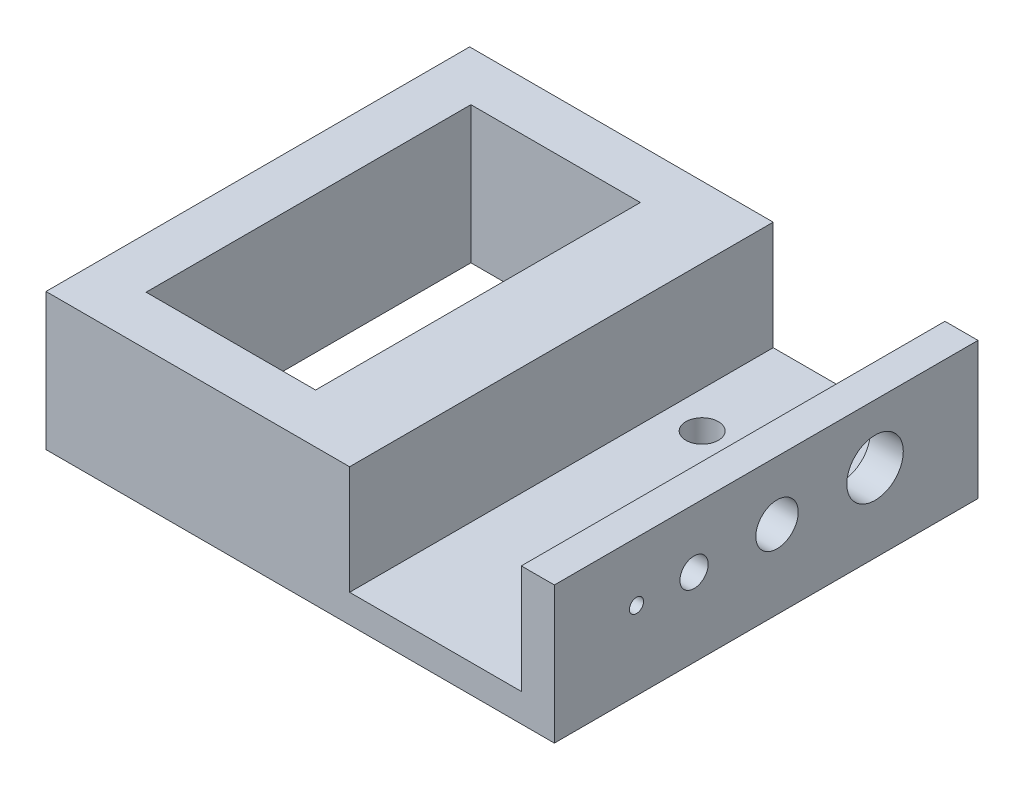
ISO-10303-21;
HEADER;
FILE_DESCRIPTION(('STEP AP214'),'2;1');
FILE_NAME('part.step','',(''),(''),'','','');
FILE_SCHEMA(('AUTOMOTIVE_DESIGN { 1 0 10303 214 1 1 1 1 }'));
ENDSEC;
DATA;
#1=APPLICATION_CONTEXT('core data for automotive mechanical design processes');
#2=APPLICATION_PROTOCOL_DEFINITION('international standard','automotive_design',2000,#1);
#3=PRODUCT_CONTEXT('',#1,'mechanical');
#4=PRODUCT('Part','Part','',(#3));
#5=PRODUCT_RELATED_PRODUCT_CATEGORY('part','',(#4));
#6=PRODUCT_DEFINITION_FORMATION('','',#4);
#7=PRODUCT_DEFINITION_CONTEXT('part definition',#1,'design');
#8=PRODUCT_DEFINITION('design','',#6,#7);
#9=PRODUCT_DEFINITION_SHAPE('','',#8);
#10=(LENGTH_UNIT() NAMED_UNIT(*) SI_UNIT(.MILLI.,.METRE.));
#11=(NAMED_UNIT(*) PLANE_ANGLE_UNIT() SI_UNIT($,.RADIAN.));
#12=(NAMED_UNIT(*) SI_UNIT($,.STERADIAN.) SOLID_ANGLE_UNIT());
#13=UNCERTAINTY_MEASURE_WITH_UNIT(LENGTH_MEASURE(1.E-05),#10,'distance_accuracy_value','');
#14=(GEOMETRIC_REPRESENTATION_CONTEXT(3) GLOBAL_UNCERTAINTY_ASSIGNED_CONTEXT((#13)) GLOBAL_UNIT_ASSIGNED_CONTEXT((#10,
#11,#12)) REPRESENTATION_CONTEXT('',''));
#15=CARTESIAN_POINT('',(0.,0.,0.));
#16=DIRECTION('',(0.,0.,1.));
#17=DIRECTION('',(1.,0.,0.));
#18=AXIS2_PLACEMENT_3D('',#15,#16,#17);
#19=CARTESIAN_POINT('',(18.,10.,0.));
#20=DIRECTION('',(1.,0.,0.));
#21=DIRECTION('',(0.,0.,-1.));
#22=AXIS2_PLACEMENT_3D('',#19,#20,#21);
#23=PLANE('',#22);
#24=CARTESIAN_POINT('',(18.,5.53489453808616,9.18421985815603));
#25=DIRECTION('',(1.,0.,0.));
#26=DIRECTION('',(0.,0.,-1.));
#27=AXIS2_PLACEMENT_3D('',#24,#25,#26);
#28=CIRCLE('',#27,0.500000000000001);
#29=CARTESIAN_POINT('',(18.,5.53489453808616,8.68421985815603));
#30=VERTEX_POINT('',#29);
#31=EDGE_CURVE('E239',#30,#30,#28,.T.);
#32=ORIENTED_EDGE('',*,*,#31,.F.);
#33=EDGE_LOOP('',(#32));
#34=FACE_BOUND('',#33,.T.);
#35=CARTESIAN_POINT('',(18.,5.53489453808616,5.10716358109975));
#36=DIRECTION('',(1.,0.,0.));
#37=DIRECTION('',(0.,0.,-1.));
#38=AXIS2_PLACEMENT_3D('',#35,#36,#37);
#39=CIRCLE('',#38,1.);
#40=CARTESIAN_POINT('',(18.,5.53489453808616,4.10716358109975));
#41=VERTEX_POINT('',#40);
#42=EDGE_CURVE('E279',#41,#41,#39,.T.);
#43=ORIENTED_EDGE('',*,*,#42,.F.);
#44=EDGE_LOOP('',(#43));
#45=FACE_BOUND('',#44,.T.);
#46=CARTESIAN_POINT('',(18.,5.53489453808616,-0.769869669337758));
#47=DIRECTION('',(1.,0.,0.));
#48=DIRECTION('',(0.,0.,-1.));
#49=AXIS2_PLACEMENT_3D('',#46,#47,#48);
#50=CIRCLE('',#49,1.5);
#51=CARTESIAN_POINT('',(18.,5.53489453808616,-2.26986966933776));
#52=VERTEX_POINT('',#51);
#53=EDGE_CURVE('E283',#52,#52,#50,.T.);
#54=ORIENTED_EDGE('',*,*,#53,.F.);
#55=EDGE_LOOP('',(#54));
#56=FACE_BOUND('',#55,.T.);
#57=CARTESIAN_POINT('',(18.,5.53489453808616,-7.70953992815696));
#58=DIRECTION('',(1.,0.,0.));
#59=DIRECTION('',(0.,0.,-1.));
#60=AXIS2_PLACEMENT_3D('',#57,#58,#59);
#61=CIRCLE('',#60,2.);
#62=CARTESIAN_POINT('',(18.,5.53489453808616,-9.70953992815696));
#63=VERTEX_POINT('',#62);
#64=EDGE_CURVE('E274',#63,#63,#61,.T.);
#65=ORIENTED_EDGE('',*,*,#64,.F.);
#66=EDGE_LOOP('',(#65));
#67=FACE_BOUND('',#66,.T.);
#68=DIRECTION('',(0.,-1.,0.));
#69=VECTOR('',#68,1.);
#70=CARTESIAN_POINT('',(18.,10.,-15.));
#71=LINE('',#70,#69);
#72=CARTESIAN_POINT('',(18.,9.7,-15.));
#73=VERTEX_POINT('',#72);
#74=CARTESIAN_POINT('',(18.,0.,-15.));
#75=VERTEX_POINT('',#74);
#76=EDGE_CURVE('E219',#73,#75,#71,.T.);
#77=ORIENTED_EDGE('',*,*,#76,.F.);
#78=DIRECTION('',(0.,0.,1.));
#79=VECTOR('',#78,1.);
#80=CARTESIAN_POINT('',(18.,9.7,0.));
#81=LINE('',#80,#79);
#82=CARTESIAN_POINT('',(18.,9.7,15.));
#83=VERTEX_POINT('',#82);
#84=EDGE_CURVE('E301',#73,#83,#81,.T.);
#85=ORIENTED_EDGE('',*,*,#84,.T.);
#86=DIRECTION('',(0.,-1.,0.));
#87=VECTOR('',#86,1.);
#88=CARTESIAN_POINT('',(18.,10.,15.));
#89=LINE('',#88,#87);
#90=CARTESIAN_POINT('',(18.,0.,15.));
#91=VERTEX_POINT('',#90);
#92=EDGE_CURVE('E149',#83,#91,#89,.T.);
#93=ORIENTED_EDGE('',*,*,#92,.T.);
#94=DIRECTION('',(0.,0.,1.));
#95=VECTOR('',#94,1.);
#96=CARTESIAN_POINT('',(18.,0.,0.));
#97=LINE('',#96,#95);
#98=EDGE_CURVE('E194',#75,#91,#97,.T.);
#99=ORIENTED_EDGE('',*,*,#98,.F.);
#100=EDGE_LOOP('',(#77,#85,#93,#99));
#101=FACE_BOUND('',#100,.T.);
#102=ADVANCED_FACE('F45',(#34,#45,#56,#67,#101),#23,.T.);
#103=CARTESIAN_POINT('',(0.,10.,-15.));
#104=DIRECTION('',(0.,0.,-1.));
#105=DIRECTION('',(-1.,0.,0.));
#106=AXIS2_PLACEMENT_3D('',#103,#104,#105);
#107=PLANE('',#106);
#108=DIRECTION('',(0.,-1.,0.));
#109=VECTOR('',#108,1.);
#110=CARTESIAN_POINT('',(-18.,10.,-15.));
#111=LINE('',#110,#109);
#112=CARTESIAN_POINT('',(-18.,9.7,-15.));
#113=VERTEX_POINT('',#112);
#114=CARTESIAN_POINT('',(-18.,0.,-15.));
#115=VERTEX_POINT('',#114);
#116=EDGE_CURVE('E216',#113,#115,#111,.T.);
#117=ORIENTED_EDGE('',*,*,#116,.F.);
#118=DIRECTION('',(1.,0.,0.));
#119=VECTOR('',#118,1.);
#120=CARTESIAN_POINT('',(0.,9.7,-15.));
#121=LINE('',#120,#119);
#122=CARTESIAN_POINT('',(3.49898960918438,9.7,-15.));
#123=VERTEX_POINT('',#122);
#124=EDGE_CURVE('E311',#113,#123,#121,.T.);
#125=ORIENTED_EDGE('',*,*,#124,.T.);
#126=DIRECTION('',(0.,1.,0.));
#127=VECTOR('',#126,1.);
#128=CARTESIAN_POINT('',(3.49898960918438,10.,-15.));
#129=LINE('',#128,#127);
#130=CARTESIAN_POINT('',(3.49898960918438,2.,-15.));
#131=VERTEX_POINT('',#130);
#132=EDGE_CURVE('E170',#131,#123,#129,.T.);
#133=ORIENTED_EDGE('',*,*,#132,.F.);
#134=DIRECTION('',(1.,0.,0.));
#135=VECTOR('',#134,1.);
#136=CARTESIAN_POINT('',(0.,2.,-15.));
#137=LINE('',#136,#135);
#138=CARTESIAN_POINT('',(15.6598148259363,2.,-15.));
#139=VERTEX_POINT('',#138);
#140=EDGE_CURVE('E174',#131,#139,#137,.T.);
#141=ORIENTED_EDGE('',*,*,#140,.T.);
#142=DIRECTION('',(0.,-1.,0.));
#143=VECTOR('',#142,1.);
#144=CARTESIAN_POINT('',(15.6598148259363,10.,-15.));
#145=LINE('',#144,#143);
#146=CARTESIAN_POINT('',(15.6598148259363,9.7,-15.));
#147=VERTEX_POINT('',#146);
#148=EDGE_CURVE('E157',#147,#139,#145,.T.);
#149=ORIENTED_EDGE('',*,*,#148,.F.);
#150=EDGE_CURVE('E138',#147,#73,#121,.T.);
#151=ORIENTED_EDGE('',*,*,#150,.T.);
#152=ORIENTED_EDGE('',*,*,#76,.T.);
#153=DIRECTION('',(1.,0.,0.));
#154=VECTOR('',#153,1.);
#155=CARTESIAN_POINT('',(0.,0.,-15.));
#156=LINE('',#155,#154);
#157=EDGE_CURVE('E198',#115,#75,#156,.T.);
#158=ORIENTED_EDGE('',*,*,#157,.F.);
#159=EDGE_LOOP('',(#117,#125,#133,#141,#149,#151,#152,#158));
#160=FACE_BOUND('',#159,.T.);
#161=ADVANCED_FACE('F344',(#160),#107,.T.);
#162=CARTESIAN_POINT('',(-18.,10.,0.));
#163=DIRECTION('',(1.,0.,0.));
#164=DIRECTION('',(0.,0.,-1.));
#165=AXIS2_PLACEMENT_3D('',#162,#163,#164);
#166=PLANE('',#165);
#167=DIRECTION('',(0.,0.,1.));
#168=VECTOR('',#167,1.);
#169=CARTESIAN_POINT('',(-18.,9.7,0.));
#170=LINE('',#169,#168);
#171=CARTESIAN_POINT('',(-18.,9.7,15.));
#172=VERTEX_POINT('',#171);
#173=EDGE_CURVE('E305',#113,#172,#170,.T.);
#174=ORIENTED_EDGE('',*,*,#173,.F.);
#175=ORIENTED_EDGE('',*,*,#116,.T.);
#176=DIRECTION('',(0.,0.,1.));
#177=VECTOR('',#176,1.);
#178=CARTESIAN_POINT('',(-18.,0.,0.));
#179=LINE('',#178,#177);
#180=CARTESIAN_POINT('',(-18.,0.,15.));
#181=VERTEX_POINT('',#180);
#182=EDGE_CURVE('E202',#115,#181,#179,.T.);
#183=ORIENTED_EDGE('',*,*,#182,.T.);
#184=DIRECTION('',(0.,-1.,0.));
#185=VECTOR('',#184,1.);
#186=CARTESIAN_POINT('',(-18.,10.,15.));
#187=LINE('',#186,#185);
#188=EDGE_CURVE('E212',#172,#181,#187,.T.);
#189=ORIENTED_EDGE('',*,*,#188,.F.);
#190=EDGE_LOOP('',(#174,#175,#183,#189));
#191=FACE_BOUND('',#190,.T.);
#192=ADVANCED_FACE('F339',(#191),#166,.F.);
#193=CARTESIAN_POINT('',(0.,10.,-11.5));
#194=DIRECTION('',(0.,0.,-1.));
#195=DIRECTION('',(-1.,0.,0.));
#196=AXIS2_PLACEMENT_3D('',#193,#194,#195);
#197=PLANE('',#196);
#198=DIRECTION('',(1.,0.,0.));
#199=VECTOR('',#198,1.);
#200=CARTESIAN_POINT('',(0.,9.7,-11.5));
#201=LINE('',#200,#199);
#202=CARTESIAN_POINT('',(-14.4102564102564,9.7,-11.5));
#203=VERTEX_POINT('',#202);
#204=CARTESIAN_POINT('',(-2.41025641025642,9.7,-11.5));
#205=VERTEX_POINT('',#204);
#206=EDGE_CURVE('E263',#203,#205,#201,.T.);
#207=ORIENTED_EDGE('',*,*,#206,.F.);
#208=DIRECTION('',(0.,-1.,0.));
#209=VECTOR('',#208,1.);
#210=CARTESIAN_POINT('',(-14.4102564102564,10.,-11.5));
#211=LINE('',#210,#209);
#212=CARTESIAN_POINT('',(-14.4102564102564,0.,-11.5));
#213=VERTEX_POINT('',#212);
#214=EDGE_CURVE('E209',#203,#213,#211,.T.);
#215=ORIENTED_EDGE('',*,*,#214,.T.);
#216=DIRECTION('',(1.,0.,0.));
#217=VECTOR('',#216,1.);
#218=CARTESIAN_POINT('',(0.,0.,-11.5));
#219=LINE('',#218,#217);
#220=CARTESIAN_POINT('',(-2.41025641025642,0.,-11.5));
#221=VERTEX_POINT('',#220);
#222=EDGE_CURVE('E178',#213,#221,#219,.T.);
#223=ORIENTED_EDGE('',*,*,#222,.T.);
#224=DIRECTION('',(0.,-1.,0.));
#225=VECTOR('',#224,1.);
#226=CARTESIAN_POINT('',(-2.41025641025642,10.,-11.5));
#227=LINE('',#226,#225);
#228=EDGE_CURVE('E213',#205,#221,#227,.T.);
#229=ORIENTED_EDGE('',*,*,#228,.F.);
#230=EDGE_LOOP('',(#207,#215,#223,#229));
#231=FACE_BOUND('',#230,.T.);
#232=ADVANCED_FACE('F47',(#231),#197,.F.);
#233=CARTESIAN_POINT('',(-2.41025641025641,10.,0.));
#234=DIRECTION('',(1.,0.,0.));
#235=DIRECTION('',(0.,0.,-1.));
#236=AXIS2_PLACEMENT_3D('',#233,#234,#235);
#237=PLANE('',#236);
#238=DIRECTION('',(0.,0.,1.));
#239=VECTOR('',#238,1.);
#240=CARTESIAN_POINT('',(-2.41025641025641,9.7,0.));
#241=LINE('',#240,#239);
#242=CARTESIAN_POINT('',(-2.41025641025641,9.7,11.5));
#243=VERTEX_POINT('',#242);
#244=EDGE_CURVE('E268',#205,#243,#241,.T.);
#245=ORIENTED_EDGE('',*,*,#244,.F.);
#246=ORIENTED_EDGE('',*,*,#228,.T.);
#247=DIRECTION('',(0.,0.,1.));
#248=VECTOR('',#247,1.);
#249=CARTESIAN_POINT('',(-2.41025641025641,0.,0.));
#250=LINE('',#249,#248);
#251=CARTESIAN_POINT('',(-2.41025641025641,0.,11.5));
#252=VERTEX_POINT('',#251);
#253=EDGE_CURVE('E182',#221,#252,#250,.T.);
#254=ORIENTED_EDGE('',*,*,#253,.T.);
#255=DIRECTION('',(0.,-1.,0.));
#256=VECTOR('',#255,1.);
#257=CARTESIAN_POINT('',(-2.41025641025641,10.,11.5));
#258=LINE('',#257,#256);
#259=EDGE_CURVE('E227',#243,#252,#258,.T.);
#260=ORIENTED_EDGE('',*,*,#259,.F.);
#261=EDGE_LOOP('',(#245,#246,#254,#260));
#262=FACE_BOUND('',#261,.T.);
#263=ADVANCED_FACE('F327',(#262),#237,.F.);
#264=CARTESIAN_POINT('',(0.,10.,11.5));
#265=DIRECTION('',(0.,0.,-1.));
#266=DIRECTION('',(-1.,0.,0.));
#267=AXIS2_PLACEMENT_3D('',#264,#265,#266);
#268=PLANE('',#267);
#269=DIRECTION('',(0.,-1.,0.));
#270=VECTOR('',#269,1.);
#271=CARTESIAN_POINT('',(-14.4102564102564,10.,11.5));
#272=LINE('',#271,#270);
#273=CARTESIAN_POINT('',(-14.4102564102564,9.7,11.5));
#274=VERTEX_POINT('',#273);
#275=CARTESIAN_POINT('',(-14.4102564102564,0.,11.5));
#276=VERTEX_POINT('',#275);
#277=EDGE_CURVE('E224',#274,#276,#272,.T.);
#278=ORIENTED_EDGE('',*,*,#277,.F.);
#279=DIRECTION('',(1.,0.,0.));
#280=VECTOR('',#279,1.);
#281=CARTESIAN_POINT('',(0.,9.7,11.5));
#282=LINE('',#281,#280);
#283=EDGE_CURVE('E61',#274,#243,#282,.T.);
#284=ORIENTED_EDGE('',*,*,#283,.T.);
#285=ORIENTED_EDGE('',*,*,#259,.T.);
#286=DIRECTION('',(1.,0.,0.));
#287=VECTOR('',#286,1.);
#288=CARTESIAN_POINT('',(0.,0.,11.5));
#289=LINE('',#288,#287);
#290=EDGE_CURVE('E186',#276,#252,#289,.T.);
#291=ORIENTED_EDGE('',*,*,#290,.F.);
#292=EDGE_LOOP('',(#278,#284,#285,#291));
#293=FACE_BOUND('',#292,.T.);
#294=ADVANCED_FACE('F325',(#293),#268,.T.);
#295=CARTESIAN_POINT('',(-14.4102564102564,10.,0.));
#296=DIRECTION('',(1.,0.,0.));
#297=DIRECTION('',(0.,0.,-1.));
#298=AXIS2_PLACEMENT_3D('',#295,#296,#297);
#299=PLANE('',#298);
#300=ORIENTED_EDGE('',*,*,#214,.F.);
#301=DIRECTION('',(0.,0.,1.));
#302=VECTOR('',#301,1.);
#303=CARTESIAN_POINT('',(-14.4102564102564,9.7,0.));
#304=LINE('',#303,#302);
#305=EDGE_CURVE('E312',#203,#274,#304,.T.);
#306=ORIENTED_EDGE('',*,*,#305,.T.);
#307=ORIENTED_EDGE('',*,*,#277,.T.);
#308=DIRECTION('',(0.,0.,1.));
#309=VECTOR('',#308,1.);
#310=CARTESIAN_POINT('',(-14.4102564102564,0.,0.));
#311=LINE('',#310,#309);
#312=EDGE_CURVE('E190',#213,#276,#311,.T.);
#313=ORIENTED_EDGE('',*,*,#312,.F.);
#314=EDGE_LOOP('',(#300,#306,#307,#313));
#315=FACE_BOUND('',#314,.T.);
#316=ADVANCED_FACE('F336',(#315),#299,.T.);
#317=CARTESIAN_POINT('',(0.,10.,15.));
#318=DIRECTION('',(0.,0.,-1.));
#319=DIRECTION('',(-1.,0.,0.));
#320=AXIS2_PLACEMENT_3D('',#317,#318,#319);
#321=PLANE('',#320);
#322=DIRECTION('',(1.,0.,0.));
#323=VECTOR('',#322,1.);
#324=CARTESIAN_POINT('',(0.,9.7,15.));
#325=LINE('',#324,#323);
#326=CARTESIAN_POINT('',(3.49898960918438,9.7,15.));
#327=VERTEX_POINT('',#326);
#328=EDGE_CURVE('E69',#172,#327,#325,.T.);
#329=ORIENTED_EDGE('',*,*,#328,.F.);
#330=ORIENTED_EDGE('',*,*,#188,.T.);
#331=DIRECTION('',(1.,0.,0.));
#332=VECTOR('',#331,1.);
#333=CARTESIAN_POINT('',(0.,0.,15.));
#334=LINE('',#333,#332);
#335=EDGE_CURVE('E206',#181,#91,#334,.T.);
#336=ORIENTED_EDGE('',*,*,#335,.T.);
#337=ORIENTED_EDGE('',*,*,#92,.F.);
#338=CARTESIAN_POINT('',(15.6598148259363,9.7,15.));
#339=VERTEX_POINT('',#338);
#340=EDGE_CURVE('E135',#339,#83,#325,.T.);
#341=ORIENTED_EDGE('',*,*,#340,.F.);
#342=DIRECTION('',(0.,-1.,0.));
#343=VECTOR('',#342,1.);
#344=CARTESIAN_POINT('',(15.6598148259363,10.,15.));
#345=LINE('',#344,#343);
#346=CARTESIAN_POINT('',(15.6598148259363,2.,15.));
#347=VERTEX_POINT('',#346);
#348=EDGE_CURVE('E146',#339,#347,#345,.T.);
#349=ORIENTED_EDGE('',*,*,#348,.T.);
#350=DIRECTION('',(1.,0.,0.));
#351=VECTOR('',#350,1.);
#352=CARTESIAN_POINT('',(0.,2.,15.));
#353=LINE('',#352,#351);
#354=CARTESIAN_POINT('',(3.49898960918438,2.,15.));
#355=VERTEX_POINT('',#354);
#356=EDGE_CURVE('E54',#355,#347,#353,.T.);
#357=ORIENTED_EDGE('',*,*,#356,.F.);
#358=DIRECTION('',(0.,1.,0.));
#359=VECTOR('',#358,1.);
#360=CARTESIAN_POINT('',(3.49898960918438,10.,15.));
#361=LINE('',#360,#359);
#362=EDGE_CURVE('E161',#355,#327,#361,.T.);
#363=ORIENTED_EDGE('',*,*,#362,.T.);
#364=EDGE_LOOP('',(#329,#330,#336,#337,#341,#349,#357,#363));
#365=FACE_BOUND('',#364,.T.);
#366=ADVANCED_FACE('F144',(#365),#321,.F.);
#367=CARTESIAN_POINT('',(3.49898960918438,2.,-18.0101016769036));
#368=DIRECTION('',(-1.,0.,0.));
#369=DIRECTION('',(0.,0.,1.));
#370=AXIS2_PLACEMENT_3D('',#367,#368,#369);
#371=PLANE('',#370);
#372=DIRECTION('',(0.,0.,-1.));
#373=VECTOR('',#372,1.);
#374=CARTESIAN_POINT('',(3.49898960918438,9.7,-18.0101016769036));
#375=LINE('',#374,#373);
#376=EDGE_CURVE('E298',#327,#123,#375,.T.);
#377=ORIENTED_EDGE('',*,*,#376,.F.);
#378=ORIENTED_EDGE('',*,*,#362,.F.);
#379=DIRECTION('',(0.,0.,1.));
#380=VECTOR('',#379,1.);
#381=CARTESIAN_POINT('',(3.49898960918438,2.,-18.0101016769036));
#382=LINE('',#381,#380);
#383=EDGE_CURVE('E163',#131,#355,#382,.T.);
#384=ORIENTED_EDGE('',*,*,#383,.F.);
#385=ORIENTED_EDGE('',*,*,#132,.T.);
#386=EDGE_LOOP('',(#377,#378,#384,#385));
#387=FACE_BOUND('',#386,.T.);
#388=ADVANCED_FACE('F297',(#387),#371,.F.);
#389=CARTESIAN_POINT('',(15.6598148259363,2.,-18.0101016769036));
#390=DIRECTION('',(1.,0.,0.));
#391=DIRECTION('',(0.,0.,-1.));
#392=AXIS2_PLACEMENT_3D('',#389,#390,#391);
#393=PLANE('',#392);
#394=CARTESIAN_POINT('',(15.6598148259363,5.53489453808616,-7.70953992815696));
#395=DIRECTION('',(1.,0.,0.));
#396=DIRECTION('',(0.,0.,-1.));
#397=AXIS2_PLACEMENT_3D('',#394,#395,#396);
#398=CIRCLE('',#397,2.);
#399=CARTESIAN_POINT('',(15.6598148259363,5.53489453808616,-9.70953992815696));
#400=VERTEX_POINT('',#399);
#401=EDGE_CURVE('E234',#400,#400,#398,.T.);
#402=ORIENTED_EDGE('',*,*,#401,.T.);
#403=EDGE_LOOP('',(#402));
#404=FACE_BOUND('',#403,.T.);
#405=CARTESIAN_POINT('',(15.6598148259363,5.53489453808616,-0.769869669337757));
#406=DIRECTION('',(1.,0.,0.));
#407=DIRECTION('',(0.,0.,-1.));
#408=AXIS2_PLACEMENT_3D('',#405,#406,#407);
#409=CIRCLE('',#408,1.5);
#410=CARTESIAN_POINT('',(15.6598148259363,5.53489453808616,-2.26986966933776));
#411=VERTEX_POINT('',#410);
#412=EDGE_CURVE('E238',#411,#411,#409,.T.);
#413=ORIENTED_EDGE('',*,*,#412,.T.);
#414=EDGE_LOOP('',(#413));
#415=FACE_BOUND('',#414,.T.);
#416=CARTESIAN_POINT('',(15.6598148259363,5.53489453808616,5.10716358109975));
#417=DIRECTION('',(1.,0.,0.));
#418=DIRECTION('',(0.,0.,-1.));
#419=AXIS2_PLACEMENT_3D('',#416,#417,#418);
#420=CIRCLE('',#419,1.);
#421=CARTESIAN_POINT('',(15.6598148259363,5.53489453808616,4.10716358109975));
#422=VERTEX_POINT('',#421);
#423=EDGE_CURVE('E243',#422,#422,#420,.T.);
#424=ORIENTED_EDGE('',*,*,#423,.T.);
#425=EDGE_LOOP('',(#424));
#426=FACE_BOUND('',#425,.T.);
#427=CARTESIAN_POINT('',(15.6598148259363,5.53489453808616,9.18421985815603));
#428=DIRECTION('',(1.,0.,0.));
#429=DIRECTION('',(0.,0.,-1.));
#430=AXIS2_PLACEMENT_3D('',#427,#428,#429);
#431=CIRCLE('',#430,0.500000000000001);
#432=CARTESIAN_POINT('',(15.6598148259363,5.53489453808616,8.68421985815603));
#433=VERTEX_POINT('',#432);
#434=EDGE_CURVE('E247',#433,#433,#431,.T.);
#435=ORIENTED_EDGE('',*,*,#434,.T.);
#436=EDGE_LOOP('',(#435));
#437=FACE_BOUND('',#436,.T.);
#438=DIRECTION('',(0.,0.,1.));
#439=VECTOR('',#438,1.);
#440=CARTESIAN_POINT('',(15.6598148259363,9.7,-18.0101016769036));
#441=LINE('',#440,#439);
#442=EDGE_CURVE('E12',#147,#339,#441,.T.);
#443=ORIENTED_EDGE('',*,*,#442,.F.);
#444=ORIENTED_EDGE('',*,*,#148,.T.);
#445=DIRECTION('',(0.,0.,-1.));
#446=VECTOR('',#445,1.);
#447=CARTESIAN_POINT('',(15.6598148259363,2.,-18.0101016769036));
#448=LINE('',#447,#446);
#449=EDGE_CURVE('E155',#347,#139,#448,.T.);
#450=ORIENTED_EDGE('',*,*,#449,.F.);
#451=ORIENTED_EDGE('',*,*,#348,.F.);
#452=EDGE_LOOP('',(#443,#444,#450,#451));
#453=FACE_BOUND('',#452,.T.);
#454=ADVANCED_FACE('F153',(#404,#415,#426,#437,#453),#393,.F.);
#455=CARTESIAN_POINT('',(6.08974358974358,-9.5,-7.37628110769229));
#456=DIRECTION('',(0.,-1.,0.));
#457=DIRECTION('',(0.,0.,-1.));
#458=AXIS2_PLACEMENT_3D('',#455,#456,#457);
#459=PLANE('',#458);
#460=CARTESIAN_POINT('',(6.08974358974358,-9.5,-7.37628110769229));
#461=DIRECTION('',(0.,-1.,0.));
#462=DIRECTION('',(0.,0.,-1.));
#463=AXIS2_PLACEMENT_3D('',#460,#461,#462);
#464=CIRCLE('',#463,1.15);
#465=CARTESIAN_POINT('',(6.08974358974358,-9.5,-8.52628110769229));
#466=VERTEX_POINT('',#465);
#467=EDGE_CURVE('E254',#466,#466,#464,.T.);
#468=ORIENTED_EDGE('',*,*,#467,.F.);
#469=EDGE_LOOP('',(#468));
#470=FACE_BOUND('',#469,.T.);
#471=CARTESIAN_POINT('',(6.08974358974358,-9.5,-7.37628110769229));
#472=DIRECTION('',(0.,-1.,0.));
#473=DIRECTION('',(0.,0.,-1.));
#474=AXIS2_PLACEMENT_3D('',#471,#472,#473);
#475=CIRCLE('',#474,2.1);
#476=CARTESIAN_POINT('',(6.08974358974358,-9.5,-9.47628110769229));
#477=VERTEX_POINT('',#476);
#478=EDGE_CURVE('E253',#477,#477,#475,.T.);
#479=ORIENTED_EDGE('',*,*,#478,.T.);
#480=EDGE_LOOP('',(#479));
#481=FACE_BOUND('',#480,.T.);
#482=ADVANCED_FACE('F391',(#470,#481),#459,.T.);
#483=CARTESIAN_POINT('',(0.,0.,0.));
#484=DIRECTION('',(0.,1.,0.));
#485=DIRECTION('',(0.,0.,1.));
#486=AXIS2_PLACEMENT_3D('',#483,#484,#485);
#487=PLANE('',#486);
#488=ORIENTED_EDGE('',*,*,#222,.F.);
#489=ORIENTED_EDGE('',*,*,#312,.T.);
#490=ORIENTED_EDGE('',*,*,#290,.T.);
#491=ORIENTED_EDGE('',*,*,#253,.F.);
#492=EDGE_LOOP('',(#488,#489,#490,#491));
#493=FACE_BOUND('',#492,.T.);
#494=ORIENTED_EDGE('',*,*,#98,.T.);
#495=ORIENTED_EDGE('',*,*,#335,.F.);
#496=ORIENTED_EDGE('',*,*,#182,.F.);
#497=ORIENTED_EDGE('',*,*,#157,.T.);
#498=EDGE_LOOP('',(#494,#495,#496,#497));
#499=FACE_BOUND('',#498,.T.);
#500=CARTESIAN_POINT('',(6.08974358974358,0.,-7.37628110769229));
#501=DIRECTION('',(0.,-1.,0.));
#502=DIRECTION('',(0.,0.,-1.));
#503=AXIS2_PLACEMENT_3D('',#500,#501,#502);
#504=CIRCLE('',#503,2.1);
#505=CARTESIAN_POINT('',(6.08974358974358,0.,-9.47628110769229));
#506=VERTEX_POINT('',#505);
#507=EDGE_CURVE('E260',#506,#506,#504,.T.);
#508=ORIENTED_EDGE('',*,*,#507,.F.);
#509=EDGE_LOOP('',(#508));
#510=FACE_BOUND('',#509,.T.);
#511=ADVANCED_FACE('F331',(#493,#499,#510),#487,.F.);
#512=CARTESIAN_POINT('',(0.,2.,0.));
#513=DIRECTION('',(0.,1.,0.));
#514=DIRECTION('',(0.,0.,1.));
#515=AXIS2_PLACEMENT_3D('',#512,#513,#514);
#516=PLANE('',#515);
#517=CARTESIAN_POINT('',(6.08974358974358,2.,-7.37628110769229));
#518=DIRECTION('',(0.,1.,0.));
#519=DIRECTION('',(0.,0.,1.));
#520=AXIS2_PLACEMENT_3D('',#517,#518,#519);
#521=CIRCLE('',#520,1.15);
#522=CARTESIAN_POINT('',(6.08974358974358,2.,-6.22628110769229));
#523=VERTEX_POINT('',#522);
#524=EDGE_CURVE('E250',#523,#523,#521,.T.);
#525=ORIENTED_EDGE('',*,*,#524,.F.);
#526=EDGE_LOOP('',(#525));
#527=FACE_BOUND('',#526,.T.);
#528=ORIENTED_EDGE('',*,*,#383,.T.);
#529=ORIENTED_EDGE('',*,*,#356,.T.);
#530=ORIENTED_EDGE('',*,*,#449,.T.);
#531=ORIENTED_EDGE('',*,*,#140,.F.);
#532=EDGE_LOOP('',(#528,#529,#530,#531));
#533=FACE_BOUND('',#532,.T.);
#534=ADVANCED_FACE('F293',(#527,#533),#516,.T.);
#535=CARTESIAN_POINT('',(10.,5.53489453808616,-7.70953992815696));
#536=DIRECTION('',(1.,0.,0.));
#537=DIRECTION('',(0.,0.,-1.));
#538=AXIS2_PLACEMENT_3D('',#535,#536,#537);
#539=CYLINDRICAL_SURFACE('',#538,2.);
#540=ORIENTED_EDGE('',*,*,#64,.T.);
#541=EDGE_LOOP('',(#540));
#542=FACE_BOUND('',#541,.T.);
#543=ORIENTED_EDGE('',*,*,#401,.F.);
#544=EDGE_LOOP('',(#543));
#545=FACE_BOUND('',#544,.T.);
#546=ADVANCED_FACE('F533',(#542,#545),#539,.F.);
#547=CARTESIAN_POINT('',(10.,5.53489453808616,-0.769869669337755));
#548=DIRECTION('',(1.,0.,0.));
#549=DIRECTION('',(0.,0.,-1.));
#550=AXIS2_PLACEMENT_3D('',#547,#548,#549);
#551=CYLINDRICAL_SURFACE('',#550,1.5);
#552=ORIENTED_EDGE('',*,*,#53,.T.);
#553=EDGE_LOOP('',(#552));
#554=FACE_BOUND('',#553,.T.);
#555=ORIENTED_EDGE('',*,*,#412,.F.);
#556=EDGE_LOOP('',(#555));
#557=FACE_BOUND('',#556,.T.);
#558=ADVANCED_FACE('F522',(#554,#557),#551,.F.);
#559=CARTESIAN_POINT('',(10.,5.53489453808616,5.10716358109975));
#560=DIRECTION('',(1.,0.,0.));
#561=DIRECTION('',(0.,0.,-1.));
#562=AXIS2_PLACEMENT_3D('',#559,#560,#561);
#563=CYLINDRICAL_SURFACE('',#562,1.);
#564=ORIENTED_EDGE('',*,*,#42,.T.);
#565=EDGE_LOOP('',(#564));
#566=FACE_BOUND('',#565,.T.);
#567=ORIENTED_EDGE('',*,*,#423,.F.);
#568=EDGE_LOOP('',(#567));
#569=FACE_BOUND('',#568,.T.);
#570=ADVANCED_FACE('F511',(#566,#569),#563,.F.);
#571=CARTESIAN_POINT('',(10.,5.53489453808616,9.18421985815603));
#572=DIRECTION('',(1.,0.,0.));
#573=DIRECTION('',(0.,0.,-1.));
#574=AXIS2_PLACEMENT_3D('',#571,#572,#573);
#575=CYLINDRICAL_SURFACE('',#574,0.500000000000001);
#576=ORIENTED_EDGE('',*,*,#31,.T.);
#577=EDGE_LOOP('',(#576));
#578=FACE_BOUND('',#577,.T.);
#579=ORIENTED_EDGE('',*,*,#434,.F.);
#580=EDGE_LOOP('',(#579));
#581=FACE_BOUND('',#580,.T.);
#582=ADVANCED_FACE('F479',(#578,#581),#575,.F.);
#583=CARTESIAN_POINT('',(6.08974358974358,0.,-7.37628110769229));
#584=DIRECTION('',(0.,-1.,0.));
#585=DIRECTION('',(0.,0.,-1.));
#586=AXIS2_PLACEMENT_3D('',#583,#584,#585);
#587=CYLINDRICAL_SURFACE('',#586,2.1);
#588=ORIENTED_EDGE('',*,*,#507,.T.);
#589=EDGE_LOOP('',(#588));
#590=FACE_BOUND('',#589,.T.);
#591=ORIENTED_EDGE('',*,*,#478,.F.);
#592=EDGE_LOOP('',(#591));
#593=FACE_BOUND('',#592,.T.);
#594=ADVANCED_FACE('F468',(#590,#593),#587,.T.);
#595=CARTESIAN_POINT('',(6.08974358974358,4.,-7.37628110769229));
#596=DIRECTION('',(0.,-1.,0.));
#597=DIRECTION('',(0.,0.,-1.));
#598=AXIS2_PLACEMENT_3D('',#595,#596,#597);
#599=CYLINDRICAL_SURFACE('',#598,1.15);
#600=ORIENTED_EDGE('',*,*,#524,.T.);
#601=EDGE_LOOP('',(#600));
#602=FACE_BOUND('',#601,.T.);
#603=ORIENTED_EDGE('',*,*,#467,.T.);
#604=EDGE_LOOP('',(#603));
#605=FACE_BOUND('',#604,.T.);
#606=ADVANCED_FACE('F401',(#602,#605),#599,.F.);
#607=CARTESIAN_POINT('',(0.,9.7,0.));
#608=DIRECTION('',(0.,1.,0.));
#609=DIRECTION('',(0.,0.,1.));
#610=AXIS2_PLACEMENT_3D('',#607,#608,#609);
#611=PLANE('',#610);
#612=ORIENTED_EDGE('',*,*,#150,.F.);
#613=ORIENTED_EDGE('',*,*,#442,.T.);
#614=ORIENTED_EDGE('',*,*,#340,.T.);
#615=ORIENTED_EDGE('',*,*,#84,.F.);
#616=EDGE_LOOP('',(#612,#613,#614,#615));
#617=FACE_BOUND('',#616,.T.);
#618=ADVANCED_FACE('F134',(#617),#611,.T.);
#619=ORIENTED_EDGE('',*,*,#173,.T.);
#620=ORIENTED_EDGE('',*,*,#328,.T.);
#621=ORIENTED_EDGE('',*,*,#376,.T.);
#622=ORIENTED_EDGE('',*,*,#124,.F.);
#623=EDGE_LOOP('',(#619,#620,#621,#622));
#624=FACE_BOUND('',#623,.T.);
#625=ORIENTED_EDGE('',*,*,#206,.T.);
#626=ORIENTED_EDGE('',*,*,#244,.T.);
#627=ORIENTED_EDGE('',*,*,#283,.F.);
#628=ORIENTED_EDGE('',*,*,#305,.F.);
#629=EDGE_LOOP('',(#625,#626,#627,#628));
#630=FACE_BOUND('',#629,.T.);
#631=ADVANCED_FACE('F318',(#624,#630),#611,.T.);
#632=CLOSED_SHELL('',(#102,#161,#192,#232,#263,#294,#316,#366,#388,#454,#482,#511,#534,#546,
#558,#570,#582,#594,#606,#618,#631));
#633=MANIFOLD_SOLID_BREP('B2',#632);
#634=ADVANCED_BREP_SHAPE_REPRESENTATION('',(#18,#633),#14);
#635=SHAPE_DEFINITION_REPRESENTATION(#9,#634);
ENDSEC;
END-ISO-10303-21;
